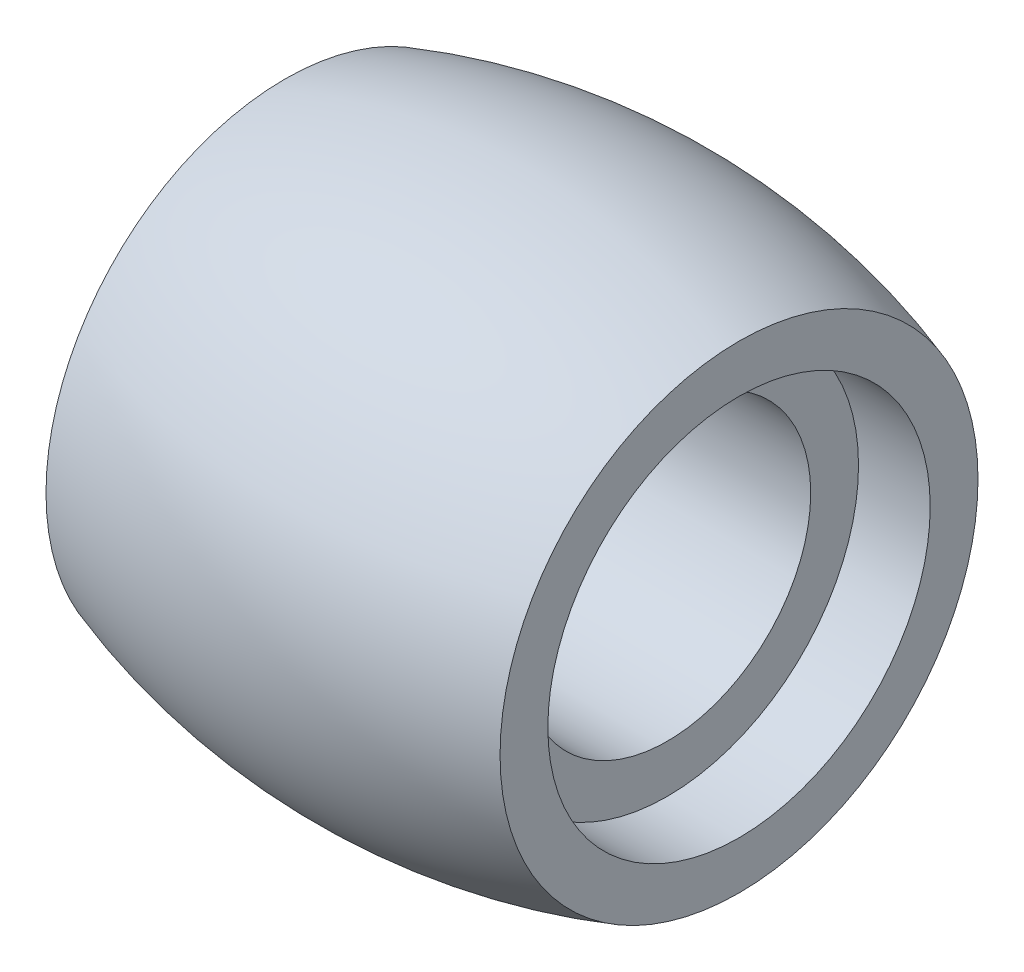
ISO-10303-21;
HEADER;
FILE_DESCRIPTION(('STEP AP214'),'2;1');
FILE_NAME('part.step','',(''),(''),'','','');
FILE_SCHEMA(('AUTOMOTIVE_DESIGN { 1 0 10303 214 1 1 1 1 }'));
ENDSEC;
DATA;
#1=APPLICATION_CONTEXT('core data for automotive mechanical design processes');
#2=APPLICATION_PROTOCOL_DEFINITION('international standard','automotive_design',2000,#1);
#3=PRODUCT_CONTEXT('',#1,'mechanical');
#4=PRODUCT('Part','Part','',(#3));
#5=PRODUCT_RELATED_PRODUCT_CATEGORY('part','',(#4));
#6=PRODUCT_DEFINITION_FORMATION('','',#4);
#7=PRODUCT_DEFINITION_CONTEXT('part definition',#1,'design');
#8=PRODUCT_DEFINITION('design','',#6,#7);
#9=PRODUCT_DEFINITION_SHAPE('','',#8);
#10=(LENGTH_UNIT() NAMED_UNIT(*) SI_UNIT(.MILLI.,.METRE.));
#11=(NAMED_UNIT(*) PLANE_ANGLE_UNIT() SI_UNIT($,.RADIAN.));
#12=(NAMED_UNIT(*) SI_UNIT($,.STERADIAN.) SOLID_ANGLE_UNIT());
#13=UNCERTAINTY_MEASURE_WITH_UNIT(LENGTH_MEASURE(1.E-05),#10,'distance_accuracy_value','');
#14=(GEOMETRIC_REPRESENTATION_CONTEXT(3) GLOBAL_UNCERTAINTY_ASSIGNED_CONTEXT((#13)) GLOBAL_UNIT_ASSIGNED_CONTEXT((#10,
#11,#12)) REPRESENTATION_CONTEXT('',''));
#15=CARTESIAN_POINT('',(0.,0.,0.));
#16=DIRECTION('',(0.,0.,1.));
#17=DIRECTION('',(1.,0.,0.));
#18=AXIS2_PLACEMENT_3D('',#15,#16,#17);
#19=CARTESIAN_POINT('',(3.25,3.,0.));
#20=DIRECTION('',(-1.,0.,0.));
#21=DIRECTION('',(0.,0.,1.));
#22=AXIS2_PLACEMENT_3D('',#19,#20,#21);
#23=PLANE('',#22);
#24=CARTESIAN_POINT('',(3.25,0.,0.));
#25=DIRECTION('',(-1.,0.,0.));
#26=DIRECTION('',(0.,0.,1.));
#27=AXIS2_PLACEMENT_3D('',#24,#25,#26);
#28=CIRCLE('',#27,4.);
#29=CARTESIAN_POINT('',(3.25,0.,4.));
#30=VERTEX_POINT('',#29);
#31=EDGE_CURVE('E78',#30,#30,#28,.T.);
#32=ORIENTED_EDGE('',*,*,#31,.F.);
#33=EDGE_LOOP('',(#32));
#34=FACE_BOUND('',#33,.T.);
#35=CARTESIAN_POINT('',(3.25,0.,0.));
#36=DIRECTION('',(-1.,0.,0.));
#37=DIRECTION('',(0.,0.,1.));
#38=AXIS2_PLACEMENT_3D('',#35,#36,#37);
#39=CIRCLE('',#38,3.);
#40=CARTESIAN_POINT('',(3.25,0.,3.));
#41=VERTEX_POINT('',#40);
#42=EDGE_CURVE('E10',#41,#41,#39,.T.);
#43=ORIENTED_EDGE('',*,*,#42,.T.);
#44=EDGE_LOOP('',(#43));
#45=FACE_BOUND('',#44,.T.);
#46=ADVANCED_FACE('F43',(#34,#45),#23,.F.);
#47=CARTESIAN_POINT('',(-8.91796875,0.,0.));
#48=DIRECTION('',(-1.,0.,0.));
#49=DIRECTION('',(0.,0.,1.));
#50=AXIS2_PLACEMENT_3D('',#47,#48,#49);
#51=CYLINDRICAL_SURFACE('',#50,3.);
#52=ORIENTED_EDGE('',*,*,#42,.F.);
#53=EDGE_LOOP('',(#52));
#54=FACE_BOUND('',#53,.T.);
#55=CARTESIAN_POINT('',(-3.25,0.,0.));
#56=DIRECTION('',(-1.,0.,0.));
#57=DIRECTION('',(0.,0.,1.));
#58=AXIS2_PLACEMENT_3D('',#55,#56,#57);
#59=CIRCLE('',#58,3.);
#60=CARTESIAN_POINT('',(-3.25,0.,3.));
#61=VERTEX_POINT('',#60);
#62=EDGE_CURVE('E50',#61,#61,#59,.T.);
#63=ORIENTED_EDGE('',*,*,#62,.T.);
#64=EDGE_LOOP('',(#63));
#65=FACE_BOUND('',#64,.T.);
#66=ADVANCED_FACE('F86',(#54,#65),#51,.F.);
#67=CARTESIAN_POINT('',(-3.25,3.,0.));
#68=DIRECTION('',(1.,0.,0.));
#69=DIRECTION('',(0.,0.,-1.));
#70=AXIS2_PLACEMENT_3D('',#67,#68,#69);
#71=PLANE('',#70);
#72=ORIENTED_EDGE('',*,*,#62,.F.);
#73=EDGE_LOOP('',(#72));
#74=FACE_BOUND('',#73,.T.);
#75=CARTESIAN_POINT('',(-3.25,0.,0.));
#76=DIRECTION('',(-1.,0.,0.));
#77=DIRECTION('',(0.,0.,1.));
#78=AXIS2_PLACEMENT_3D('',#75,#76,#77);
#79=CIRCLE('',#78,4.);
#80=CARTESIAN_POINT('',(-3.25,0.,4.));
#81=VERTEX_POINT('',#80);
#82=EDGE_CURVE('E55',#81,#81,#79,.T.);
#83=ORIENTED_EDGE('',*,*,#82,.T.);
#84=EDGE_LOOP('',(#83));
#85=FACE_BOUND('',#84,.T.);
#86=ADVANCED_FACE('F90',(#74,#85),#71,.F.);
#87=CARTESIAN_POINT('',(-8.91796875,0.,0.));
#88=DIRECTION('',(-1.,0.,0.));
#89=DIRECTION('',(0.,0.,1.));
#90=AXIS2_PLACEMENT_3D('',#87,#88,#89);
#91=CYLINDRICAL_SURFACE('',#90,4.);
#92=ORIENTED_EDGE('',*,*,#82,.F.);
#93=EDGE_LOOP('',(#92));
#94=FACE_BOUND('',#93,.T.);
#95=CARTESIAN_POINT('',(-4.75,0.,0.));
#96=DIRECTION('',(-1.,0.,0.));
#97=DIRECTION('',(0.,0.,1.));
#98=AXIS2_PLACEMENT_3D('',#95,#96,#97);
#99=CIRCLE('',#98,4.);
#100=CARTESIAN_POINT('',(-4.75,0.,4.));
#101=VERTEX_POINT('',#100);
#102=EDGE_CURVE('E60',#101,#101,#99,.T.);
#103=ORIENTED_EDGE('',*,*,#102,.T.);
#104=EDGE_LOOP('',(#103));
#105=FACE_BOUND('',#104,.T.);
#106=ADVANCED_FACE('F95',(#94,#105),#91,.F.);
#107=CARTESIAN_POINT('',(-4.75,4.,0.));
#108=DIRECTION('',(1.,0.,0.));
#109=DIRECTION('',(0.,0.,-1.));
#110=AXIS2_PLACEMENT_3D('',#107,#108,#109);
#111=PLANE('',#110);
#112=ORIENTED_EDGE('',*,*,#102,.F.);
#113=EDGE_LOOP('',(#112));
#114=FACE_BOUND('',#113,.T.);
#115=CARTESIAN_POINT('',(-4.75,0.,0.));
#116=DIRECTION('',(-1.,0.,0.));
#117=DIRECTION('',(0.,0.,1.));
#118=AXIS2_PLACEMENT_3D('',#115,#116,#117);
#119=CIRCLE('',#118,5.);
#120=CARTESIAN_POINT('',(-4.75,0.,5.));
#121=VERTEX_POINT('',#120);
#122=EDGE_CURVE('E66',#121,#121,#119,.T.);
#123=ORIENTED_EDGE('',*,*,#122,.T.);
#124=EDGE_LOOP('',(#123));
#125=FACE_BOUND('',#124,.T.);
#126=ADVANCED_FACE('F101',(#114,#125),#111,.F.);
#127=CARTESIAN_POINT('',(0.,0.,0.));
#128=DIRECTION('',(-1.,0.,0.));
#129=DIRECTION('',(0.,0.,1.));
#130=AXIS2_PLACEMENT_3D('',#127,#128,#129);
#131=DEGENERATE_TOROIDAL_SURFACE('',#130,9.2280532751322,15.,.F.);
#132=ORIENTED_EDGE('',*,*,#122,.F.);
#133=EDGE_LOOP('',(#132));
#134=FACE_BOUND('',#133,.T.);
#135=CARTESIAN_POINT('',(4.75,0.,0.));
#136=DIRECTION('',(-1.,0.,0.));
#137=DIRECTION('',(0.,0.,1.));
#138=AXIS2_PLACEMENT_3D('',#135,#136,#137);
#139=CIRCLE('',#138,5.);
#140=CARTESIAN_POINT('',(4.75,0.,5.));
#141=VERTEX_POINT('',#140);
#142=EDGE_CURVE('E70',#141,#141,#139,.T.);
#143=ORIENTED_EDGE('',*,*,#142,.T.);
#144=EDGE_LOOP('',(#143));
#145=FACE_BOUND('',#144,.T.);
#146=ADVANCED_FACE('F105',(#134,#145),#131,.F.);
#147=CARTESIAN_POINT('',(4.75,4.,0.));
#148=DIRECTION('',(-1.,0.,0.));
#149=DIRECTION('',(0.,0.,1.));
#150=AXIS2_PLACEMENT_3D('',#147,#148,#149);
#151=PLANE('',#150);
#152=ORIENTED_EDGE('',*,*,#142,.F.);
#153=EDGE_LOOP('',(#152));
#154=FACE_BOUND('',#153,.T.);
#155=CARTESIAN_POINT('',(4.75,0.,0.));
#156=DIRECTION('',(-1.,0.,0.));
#157=DIRECTION('',(0.,0.,1.));
#158=AXIS2_PLACEMENT_3D('',#155,#156,#157);
#159=CIRCLE('',#158,4.);
#160=CARTESIAN_POINT('',(4.75,0.,4.));
#161=VERTEX_POINT('',#160);
#162=EDGE_CURVE('E74',#161,#161,#159,.T.);
#163=ORIENTED_EDGE('',*,*,#162,.T.);
#164=EDGE_LOOP('',(#163));
#165=FACE_BOUND('',#164,.T.);
#166=ADVANCED_FACE('F109',(#154,#165),#151,.F.);
#167=CARTESIAN_POINT('',(-8.91796875,0.,0.));
#168=DIRECTION('',(-1.,0.,0.));
#169=DIRECTION('',(0.,0.,1.));
#170=AXIS2_PLACEMENT_3D('',#167,#168,#169);
#171=CYLINDRICAL_SURFACE('',#170,4.);
#172=ORIENTED_EDGE('',*,*,#162,.F.);
#173=EDGE_LOOP('',(#172));
#174=FACE_BOUND('',#173,.T.);
#175=ORIENTED_EDGE('',*,*,#31,.T.);
#176=EDGE_LOOP('',(#175));
#177=FACE_BOUND('',#176,.T.);
#178=ADVANCED_FACE('F83',(#174,#177),#171,.F.);
#179=CLOSED_SHELL('',(#46,#66,#86,#106,#126,#146,#166,#178));
#180=MANIFOLD_SOLID_BREP('B2',#179);
#181=ADVANCED_BREP_SHAPE_REPRESENTATION('',(#18,#180),#14);
#182=SHAPE_DEFINITION_REPRESENTATION(#9,#181);
ENDSEC;
END-ISO-10303-21;
